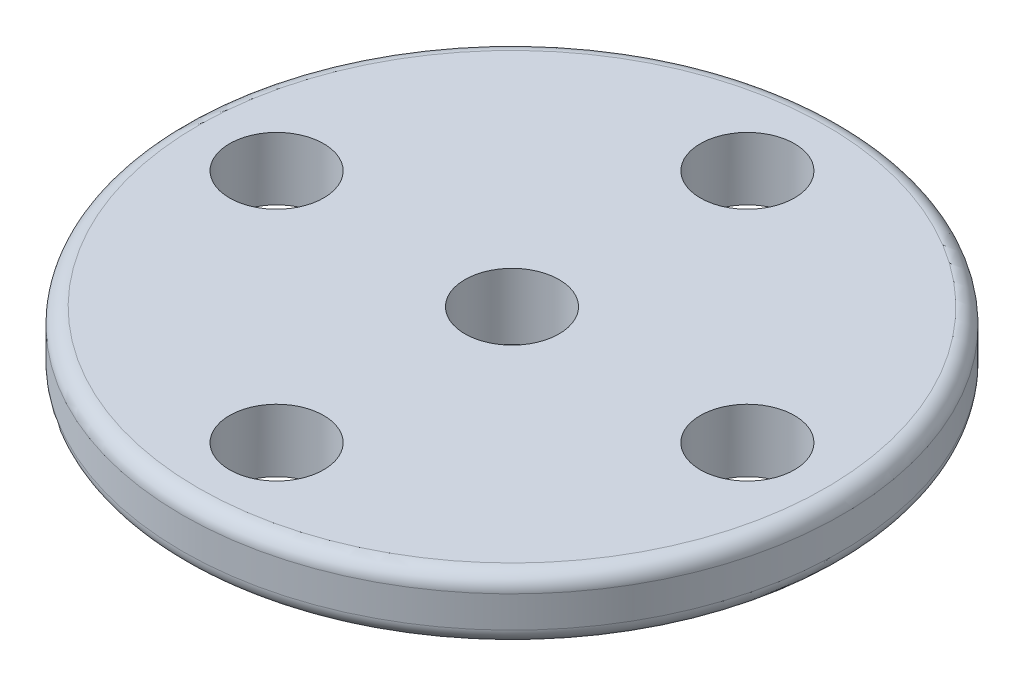
ISO-10303-21;
HEADER;
FILE_DESCRIPTION(('STEP AP214'),'2;1');
FILE_NAME('part.step','',(''),(''),'','','');
FILE_SCHEMA(('AUTOMOTIVE_DESIGN { 1 0 10303 214 1 1 1 1 }'));
ENDSEC;
DATA;
#1=APPLICATION_CONTEXT('core data for automotive mechanical design processes');
#2=APPLICATION_PROTOCOL_DEFINITION('international standard','automotive_design',2000,#1);
#3=PRODUCT_CONTEXT('',#1,'mechanical');
#4=PRODUCT('Part','Part','',(#3));
#5=PRODUCT_RELATED_PRODUCT_CATEGORY('part','',(#4));
#6=PRODUCT_DEFINITION_FORMATION('','',#4);
#7=PRODUCT_DEFINITION_CONTEXT('part definition',#1,'design');
#8=PRODUCT_DEFINITION('design','',#6,#7);
#9=PRODUCT_DEFINITION_SHAPE('','',#8);
#10=(LENGTH_UNIT() NAMED_UNIT(*) SI_UNIT(.MILLI.,.METRE.));
#11=(NAMED_UNIT(*) PLANE_ANGLE_UNIT() SI_UNIT($,.RADIAN.));
#12=(NAMED_UNIT(*) SI_UNIT($,.STERADIAN.) SOLID_ANGLE_UNIT());
#13=UNCERTAINTY_MEASURE_WITH_UNIT(LENGTH_MEASURE(1.E-05),#10,'distance_accuracy_value','');
#14=(GEOMETRIC_REPRESENTATION_CONTEXT(3) GLOBAL_UNCERTAINTY_ASSIGNED_CONTEXT((#13)) GLOBAL_UNIT_ASSIGNED_CONTEXT((#10,
#11,#12)) REPRESENTATION_CONTEXT('',''));
#15=CARTESIAN_POINT('',(0.,0.,0.));
#16=DIRECTION('',(0.,0.,1.));
#17=DIRECTION('',(1.,0.,0.));
#18=AXIS2_PLACEMENT_3D('',#15,#16,#17);
#19=CARTESIAN_POINT('',(3.,0.,0.));
#20=DIRECTION('',(0.,-1.,0.));
#21=DIRECTION('',(0.,0.,-1.));
#22=AXIS2_PLACEMENT_3D('',#19,#20,#21);
#23=PLANE('',#22);
#24=CARTESIAN_POINT('',(0.,0.,0.));
#25=DIRECTION('',(0.,-1.,0.));
#26=DIRECTION('',(0.,0.,-1.));
#27=AXIS2_PLACEMENT_3D('',#24,#25,#26);
#28=CIRCLE('',#27,4.5);
#29=CARTESIAN_POINT('',(0.,0.,-4.5));
#30=VERTEX_POINT('',#29);
#31=EDGE_CURVE('E57',#30,#30,#28,.T.);
#32=ORIENTED_EDGE('',*,*,#31,.T.);
#33=EDGE_LOOP('',(#32));
#34=FACE_BOUND('',#33,.T.);
#35=CARTESIAN_POINT('',(0.,0.,0.));
#36=DIRECTION('',(0.,-1.,0.));
#37=DIRECTION('',(0.,0.,-1.));
#38=AXIS2_PLACEMENT_3D('',#35,#36,#37);
#39=CIRCLE('',#38,3.);
#40=CARTESIAN_POINT('',(0.,0.,-3.));
#41=VERTEX_POINT('',#40);
#42=EDGE_CURVE('E69',#41,#41,#39,.T.);
#43=ORIENTED_EDGE('',*,*,#42,.F.);
#44=EDGE_LOOP('',(#43));
#45=FACE_BOUND('',#44,.T.);
#46=ADVANCED_FACE('F31',(#34,#45),#23,.T.);
#47=CARTESIAN_POINT('',(0.,0.,0.));
#48=DIRECTION('',(0.,-1.,0.));
#49=DIRECTION('',(0.,0.,-1.));
#50=AXIS2_PLACEMENT_3D('',#47,#48,#49);
#51=CYLINDRICAL_SURFACE('',#50,4.5);
#52=CARTESIAN_POINT('',(0.,3.,0.));
#53=DIRECTION('',(0.,-1.,0.));
#54=DIRECTION('',(0.,0.,-1.));
#55=AXIS2_PLACEMENT_3D('',#52,#53,#54);
#56=CIRCLE('',#55,4.5);
#57=CARTESIAN_POINT('',(0.,3.,-4.5));
#58=VERTEX_POINT('',#57);
#59=EDGE_CURVE('E54',#58,#58,#56,.T.);
#60=ORIENTED_EDGE('',*,*,#59,.T.);
#61=EDGE_LOOP('',(#60));
#62=FACE_BOUND('',#61,.T.);
#63=ORIENTED_EDGE('',*,*,#31,.F.);
#64=EDGE_LOOP('',(#63));
#65=FACE_BOUND('',#64,.T.);
#66=ADVANCED_FACE('F124',(#62,#65),#51,.T.);
#67=CARTESIAN_POINT('',(4.5,3.5,0.));
#68=DIRECTION('',(0.,-1.,0.));
#69=DIRECTION('',(0.,0.,-1.));
#70=AXIS2_PLACEMENT_3D('',#67,#68,#69);
#71=PLANE('',#70);
#72=CARTESIAN_POINT('',(7.5,3.5,0.));
#73=DIRECTION('',(0.,-1.,0.));
#74=DIRECTION('',(0.,0.,-1.));
#75=AXIS2_PLACEMENT_3D('',#72,#73,#74);
#76=CIRCLE('',#75,1.5);
#77=CARTESIAN_POINT('',(7.5,3.5,-1.5));
#78=VERTEX_POINT('',#77);
#79=EDGE_CURVE('E90',#78,#78,#76,.T.);
#80=ORIENTED_EDGE('',*,*,#79,.F.);
#81=EDGE_LOOP('',(#80));
#82=FACE_BOUND('',#81,.T.);
#83=CARTESIAN_POINT('',(0.,3.5,7.5));
#84=DIRECTION('',(0.,-1.,0.));
#85=DIRECTION('',(0.,0.,-1.));
#86=AXIS2_PLACEMENT_3D('',#83,#84,#85);
#87=CIRCLE('',#86,1.5);
#88=CARTESIAN_POINT('',(0.,3.5,6.));
#89=VERTEX_POINT('',#88);
#90=EDGE_CURVE('E84',#89,#89,#87,.T.);
#91=ORIENTED_EDGE('',*,*,#90,.F.);
#92=EDGE_LOOP('',(#91));
#93=FACE_BOUND('',#92,.T.);
#94=CARTESIAN_POINT('',(-7.5,3.5,0.));
#95=DIRECTION('',(0.,-1.,0.));
#96=DIRECTION('',(0.,0.,-1.));
#97=AXIS2_PLACEMENT_3D('',#94,#95,#96);
#98=CIRCLE('',#97,1.5);
#99=CARTESIAN_POINT('',(-7.5,3.5,-1.5));
#100=VERTEX_POINT('',#99);
#101=EDGE_CURVE('E78',#100,#100,#98,.T.);
#102=ORIENTED_EDGE('',*,*,#101,.F.);
#103=EDGE_LOOP('',(#102));
#104=FACE_BOUND('',#103,.T.);
#105=CARTESIAN_POINT('',(0.,3.5,-7.5));
#106=DIRECTION('',(0.,-1.,0.));
#107=DIRECTION('',(0.,0.,-1.));
#108=AXIS2_PLACEMENT_3D('',#105,#106,#107);
#109=CIRCLE('',#108,1.5);
#110=CARTESIAN_POINT('',(0.,3.5,-9.));
#111=VERTEX_POINT('',#110);
#112=EDGE_CURVE('E72',#111,#111,#109,.T.);
#113=ORIENTED_EDGE('',*,*,#112,.F.);
#114=EDGE_LOOP('',(#113));
#115=FACE_BOUND('',#114,.T.);
#116=CARTESIAN_POINT('',(0.,3.5,0.));
#117=DIRECTION('',(0.,-1.,0.));
#118=DIRECTION('',(0.,0.,-1.));
#119=AXIS2_PLACEMENT_3D('',#116,#117,#118);
#120=CIRCLE('',#119,5.);
#121=CARTESIAN_POINT('',(0.,3.5,-5.));
#122=VERTEX_POINT('',#121);
#123=EDGE_CURVE('E46',#122,#122,#120,.F.);
#124=ORIENTED_EDGE('',*,*,#123,.T.);
#125=EDGE_LOOP('',(#124));
#126=FACE_BOUND('',#125,.T.);
#127=CARTESIAN_POINT('',(0.,3.5,0.));
#128=DIRECTION('',(0.,-1.,0.));
#129=DIRECTION('',(0.,0.,-1.));
#130=AXIS2_PLACEMENT_3D('',#127,#128,#129);
#131=CIRCLE('',#130,10.);
#132=CARTESIAN_POINT('',(0.,3.5,-10.));
#133=VERTEX_POINT('',#132);
#134=EDGE_CURVE('E51',#133,#133,#131,.T.);
#135=ORIENTED_EDGE('',*,*,#134,.T.);
#136=EDGE_LOOP('',(#135));
#137=FACE_BOUND('',#136,.T.);
#138=ADVANCED_FACE('F130',(#82,#93,#104,#115,#126,#137),#71,.T.);
#139=CARTESIAN_POINT('',(0.,0.,0.));
#140=DIRECTION('',(0.,-1.,0.));
#141=DIRECTION('',(0.,0.,-1.));
#142=AXIS2_PLACEMENT_3D('',#139,#140,#141);
#143=CYLINDRICAL_SURFACE('',#142,10.5);
#144=CARTESIAN_POINT('',(0.,5.,0.));
#145=DIRECTION('',(0.,1.,0.));
#146=DIRECTION('',(0.,0.,1.));
#147=AXIS2_PLACEMENT_3D('',#144,#145,#146);
#148=CIRCLE('',#147,10.5);
#149=CARTESIAN_POINT('',(0.,5.,10.5));
#150=VERTEX_POINT('',#149);
#151=EDGE_CURVE('E38',#150,#150,#148,.F.);
#152=ORIENTED_EDGE('',*,*,#151,.T.);
#153=EDGE_LOOP('',(#152));
#154=FACE_BOUND('',#153,.T.);
#155=CARTESIAN_POINT('',(0.,4.,0.));
#156=DIRECTION('',(0.,-1.,0.));
#157=DIRECTION('',(0.,0.,-1.));
#158=AXIS2_PLACEMENT_3D('',#155,#156,#157);
#159=CIRCLE('',#158,10.5);
#160=CARTESIAN_POINT('',(0.,4.,-10.5));
#161=VERTEX_POINT('',#160);
#162=EDGE_CURVE('E42',#161,#161,#159,.F.);
#163=ORIENTED_EDGE('',*,*,#162,.T.);
#164=EDGE_LOOP('',(#163));
#165=FACE_BOUND('',#164,.T.);
#166=ADVANCED_FACE('F103',(#154,#165),#143,.T.);
#167=CARTESIAN_POINT('',(10.5,5.5,0.));
#168=DIRECTION('',(0.,1.,0.));
#169=DIRECTION('',(0.,0.,1.));
#170=AXIS2_PLACEMENT_3D('',#167,#168,#169);
#171=PLANE('',#170);
#172=CARTESIAN_POINT('',(7.5,5.5,0.));
#173=DIRECTION('',(0.,1.,0.));
#174=DIRECTION('',(0.,0.,1.));
#175=AXIS2_PLACEMENT_3D('',#172,#173,#174);
#176=CIRCLE('',#175,1.5);
#177=CARTESIAN_POINT('',(7.5,5.5,1.5));
#178=VERTEX_POINT('',#177);
#179=EDGE_CURVE('E93',#178,#178,#176,.T.);
#180=ORIENTED_EDGE('',*,*,#179,.F.);
#181=EDGE_LOOP('',(#180));
#182=FACE_BOUND('',#181,.T.);
#183=CARTESIAN_POINT('',(0.,5.5,7.5));
#184=DIRECTION('',(0.,1.,0.));
#185=DIRECTION('',(0.,0.,1.));
#186=AXIS2_PLACEMENT_3D('',#183,#184,#185);
#187=CIRCLE('',#186,1.5);
#188=CARTESIAN_POINT('',(0.,5.5,9.));
#189=VERTEX_POINT('',#188);
#190=EDGE_CURVE('E87',#189,#189,#187,.T.);
#191=ORIENTED_EDGE('',*,*,#190,.F.);
#192=EDGE_LOOP('',(#191));
#193=FACE_BOUND('',#192,.T.);
#194=CARTESIAN_POINT('',(-7.5,5.5,0.));
#195=DIRECTION('',(0.,1.,0.));
#196=DIRECTION('',(0.,0.,1.));
#197=AXIS2_PLACEMENT_3D('',#194,#195,#196);
#198=CIRCLE('',#197,1.5);
#199=CARTESIAN_POINT('',(-7.5,5.5,1.5));
#200=VERTEX_POINT('',#199);
#201=EDGE_CURVE('E81',#200,#200,#198,.T.);
#202=ORIENTED_EDGE('',*,*,#201,.F.);
#203=EDGE_LOOP('',(#202));
#204=FACE_BOUND('',#203,.T.);
#205=CARTESIAN_POINT('',(0.,5.5,-7.5));
#206=DIRECTION('',(0.,1.,0.));
#207=DIRECTION('',(0.,0.,1.));
#208=AXIS2_PLACEMENT_3D('',#205,#206,#207);
#209=CIRCLE('',#208,1.5);
#210=CARTESIAN_POINT('',(0.,5.5,-6.));
#211=VERTEX_POINT('',#210);
#212=EDGE_CURVE('E75',#211,#211,#209,.T.);
#213=ORIENTED_EDGE('',*,*,#212,.F.);
#214=EDGE_LOOP('',(#213));
#215=FACE_BOUND('',#214,.T.);
#216=CARTESIAN_POINT('',(0.,5.5,0.));
#217=DIRECTION('',(0.,1.,0.));
#218=DIRECTION('',(0.,0.,1.));
#219=AXIS2_PLACEMENT_3D('',#216,#217,#218);
#220=CIRCLE('',#219,10.);
#221=CARTESIAN_POINT('',(0.,5.5,10.));
#222=VERTEX_POINT('',#221);
#223=EDGE_CURVE('E10',#222,#222,#220,.T.);
#224=ORIENTED_EDGE('',*,*,#223,.T.);
#225=EDGE_LOOP('',(#224));
#226=FACE_BOUND('',#225,.T.);
#227=CARTESIAN_POINT('',(0.,5.5,0.));
#228=DIRECTION('',(0.,-1.,0.));
#229=DIRECTION('',(0.,0.,-1.));
#230=AXIS2_PLACEMENT_3D('',#227,#228,#229);
#231=CIRCLE('',#230,1.5);
#232=CARTESIAN_POINT('',(0.,5.5,-1.5));
#233=VERTEX_POINT('',#232);
#234=EDGE_CURVE('E60',#233,#233,#231,.T.);
#235=ORIENTED_EDGE('',*,*,#234,.T.);
#236=EDGE_LOOP('',(#235));
#237=FACE_BOUND('',#236,.T.);
#238=ADVANCED_FACE('F99',(#182,#193,#204,#215,#226,#237),#171,.T.);
#239=CARTESIAN_POINT('',(0.,0.,0.));
#240=DIRECTION('',(0.,-1.,0.));
#241=DIRECTION('',(0.,0.,-1.));
#242=AXIS2_PLACEMENT_3D('',#239,#240,#241);
#243=CYLINDRICAL_SURFACE('',#242,1.5);
#244=CARTESIAN_POINT('',(0.,3.4,0.));
#245=DIRECTION('',(0.,-1.,0.));
#246=DIRECTION('',(0.,0.,-1.));
#247=AXIS2_PLACEMENT_3D('',#244,#245,#246);
#248=CIRCLE('',#247,1.5);
#249=CARTESIAN_POINT('',(0.,3.4,-1.5));
#250=VERTEX_POINT('',#249);
#251=EDGE_CURVE('E63',#250,#250,#248,.T.);
#252=ORIENTED_EDGE('',*,*,#251,.T.);
#253=EDGE_LOOP('',(#252));
#254=FACE_BOUND('',#253,.T.);
#255=ORIENTED_EDGE('',*,*,#234,.F.);
#256=EDGE_LOOP('',(#255));
#257=FACE_BOUND('',#256,.T.);
#258=ADVANCED_FACE('F102',(#254,#257),#243,.F.);
#259=CARTESIAN_POINT('',(3.,3.4,0.));
#260=DIRECTION('',(0.,-1.,0.));
#261=DIRECTION('',(0.,0.,-1.));
#262=AXIS2_PLACEMENT_3D('',#259,#260,#261);
#263=PLANE('',#262);
#264=CARTESIAN_POINT('',(0.,3.4,0.));
#265=DIRECTION('',(0.,-1.,0.));
#266=DIRECTION('',(0.,0.,-1.));
#267=AXIS2_PLACEMENT_3D('',#264,#265,#266);
#268=CIRCLE('',#267,3.);
#269=CARTESIAN_POINT('',(0.,3.4,-3.));
#270=VERTEX_POINT('',#269);
#271=EDGE_CURVE('E66',#270,#270,#268,.T.);
#272=ORIENTED_EDGE('',*,*,#271,.T.);
#273=EDGE_LOOP('',(#272));
#274=FACE_BOUND('',#273,.T.);
#275=ORIENTED_EDGE('',*,*,#251,.F.);
#276=EDGE_LOOP('',(#275));
#277=FACE_BOUND('',#276,.T.);
#278=ADVANCED_FACE('F114',(#274,#277),#263,.T.);
#279=CARTESIAN_POINT('',(0.,0.,0.));
#280=DIRECTION('',(0.,-1.,0.));
#281=DIRECTION('',(0.,0.,-1.));
#282=AXIS2_PLACEMENT_3D('',#279,#280,#281);
#283=CYLINDRICAL_SURFACE('',#282,3.);
#284=ORIENTED_EDGE('',*,*,#42,.T.);
#285=EDGE_LOOP('',(#284));
#286=FACE_BOUND('',#285,.T.);
#287=ORIENTED_EDGE('',*,*,#271,.F.);
#288=EDGE_LOOP('',(#287));
#289=FACE_BOUND('',#288,.T.);
#290=ADVANCED_FACE('F120',(#286,#289),#283,.F.);
#291=CARTESIAN_POINT('',(0.,3.,0.));
#292=DIRECTION('',(0.,-1.,0.));
#293=DIRECTION('',(0.,0.,-1.));
#294=AXIS2_PLACEMENT_3D('',#291,#292,#293);
#295=TOROIDAL_SURFACE('',#294,5.,0.5);
#296=ORIENTED_EDGE('',*,*,#123,.F.);
#297=EDGE_LOOP('',(#296));
#298=FACE_BOUND('',#297,.T.);
#299=ORIENTED_EDGE('',*,*,#59,.F.);
#300=EDGE_LOOP('',(#299));
#301=FACE_BOUND('',#300,.T.);
#302=ADVANCED_FACE('F136',(#298,#301),#295,.F.);
#303=CARTESIAN_POINT('',(0.,5.,0.));
#304=DIRECTION('',(0.,1.,0.));
#305=DIRECTION('',(0.,0.,1.));
#306=AXIS2_PLACEMENT_3D('',#303,#304,#305);
#307=TOROIDAL_SURFACE('',#306,10.,0.5);
#308=ORIENTED_EDGE('',*,*,#223,.F.);
#309=EDGE_LOOP('',(#308));
#310=FACE_BOUND('',#309,.T.);
#311=ORIENTED_EDGE('',*,*,#151,.F.);
#312=EDGE_LOOP('',(#311));
#313=FACE_BOUND('',#312,.T.);
#314=ADVANCED_FACE('F138',(#310,#313),#307,.T.);
#315=CARTESIAN_POINT('',(0.,4.,0.));
#316=DIRECTION('',(0.,-1.,0.));
#317=DIRECTION('',(0.,0.,-1.));
#318=AXIS2_PLACEMENT_3D('',#315,#316,#317);
#319=TOROIDAL_SURFACE('',#318,10.,0.5);
#320=ORIENTED_EDGE('',*,*,#162,.F.);
#321=EDGE_LOOP('',(#320));
#322=FACE_BOUND('',#321,.T.);
#323=ORIENTED_EDGE('',*,*,#134,.F.);
#324=EDGE_LOOP('',(#323));
#325=FACE_BOUND('',#324,.T.);
#326=ADVANCED_FACE('F33',(#322,#325),#319,.T.);
#327=CARTESIAN_POINT('',(0.,0.,-7.5));
#328=DIRECTION('',(0.,1.,0.));
#329=DIRECTION('',(0.,0.,1.));
#330=AXIS2_PLACEMENT_3D('',#327,#328,#329);
#331=CYLINDRICAL_SURFACE('',#330,1.5);
#332=ORIENTED_EDGE('',*,*,#112,.T.);
#333=EDGE_LOOP('',(#332));
#334=FACE_BOUND('',#333,.T.);
#335=ORIENTED_EDGE('',*,*,#212,.T.);
#336=EDGE_LOOP('',(#335));
#337=FACE_BOUND('',#336,.T.);
#338=ADVANCED_FACE('F145',(#334,#337),#331,.F.);
#339=CARTESIAN_POINT('',(-7.5,0.,0.));
#340=DIRECTION('',(0.,1.,0.));
#341=DIRECTION('',(0.,0.,1.));
#342=AXIS2_PLACEMENT_3D('',#339,#340,#341);
#343=CYLINDRICAL_SURFACE('',#342,1.5);
#344=ORIENTED_EDGE('',*,*,#101,.T.);
#345=EDGE_LOOP('',(#344));
#346=FACE_BOUND('',#345,.T.);
#347=ORIENTED_EDGE('',*,*,#201,.T.);
#348=EDGE_LOOP('',(#347));
#349=FACE_BOUND('',#348,.T.);
#350=ADVANCED_FACE('F151',(#346,#349),#343,.F.);
#351=CARTESIAN_POINT('',(0.,0.,7.5));
#352=DIRECTION('',(0.,1.,0.));
#353=DIRECTION('',(0.,0.,1.));
#354=AXIS2_PLACEMENT_3D('',#351,#352,#353);
#355=CYLINDRICAL_SURFACE('',#354,1.5);
#356=ORIENTED_EDGE('',*,*,#90,.T.);
#357=EDGE_LOOP('',(#356));
#358=FACE_BOUND('',#357,.T.);
#359=ORIENTED_EDGE('',*,*,#190,.T.);
#360=EDGE_LOOP('',(#359));
#361=FACE_BOUND('',#360,.T.);
#362=ADVANCED_FACE('F181',(#358,#361),#355,.F.);
#363=CARTESIAN_POINT('',(7.5,0.,0.));
#364=DIRECTION('',(0.,1.,0.));
#365=DIRECTION('',(0.,0.,1.));
#366=AXIS2_PLACEMENT_3D('',#363,#364,#365);
#367=CYLINDRICAL_SURFACE('',#366,1.5);
#368=ORIENTED_EDGE('',*,*,#79,.T.);
#369=EDGE_LOOP('',(#368));
#370=FACE_BOUND('',#369,.T.);
#371=ORIENTED_EDGE('',*,*,#179,.T.);
#372=EDGE_LOOP('',(#371));
#373=FACE_BOUND('',#372,.T.);
#374=ADVANCED_FACE('F97',(#370,#373),#367,.F.);
#375=CLOSED_SHELL('',(#46,#66,#138,#166,#238,#258,#278,#290,#302,#314,#326,#338,#350,#362,#374));
#376=MANIFOLD_SOLID_BREP('B2',#375);
#377=ADVANCED_BREP_SHAPE_REPRESENTATION('',(#18,#376),#14);
#378=SHAPE_DEFINITION_REPRESENTATION(#9,#377);
ENDSEC;
END-ISO-10303-21;
